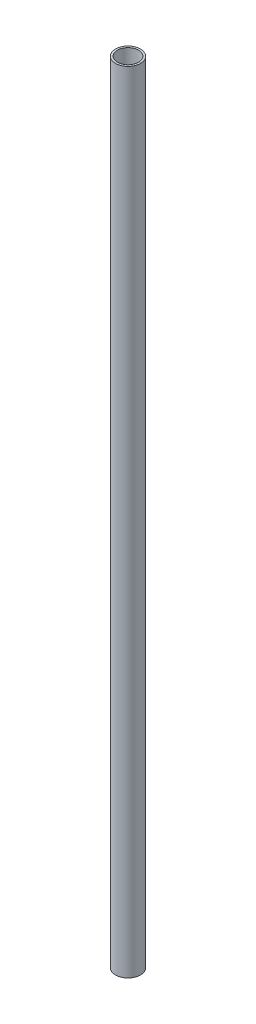
ISO-10303-21;
HEADER;
FILE_DESCRIPTION(('STEP AP214'),'2;1');
FILE_NAME('part.step','',(''),(''),'','','');
FILE_SCHEMA(('AUTOMOTIVE_DESIGN { 1 0 10303 214 1 1 1 1 }'));
ENDSEC;
DATA;
#1=APPLICATION_CONTEXT('core data for automotive mechanical design processes');
#2=APPLICATION_PROTOCOL_DEFINITION('international standard','automotive_design',2000,#1);
#3=PRODUCT_CONTEXT('',#1,'mechanical');
#4=PRODUCT('Part','Part','',(#3));
#5=PRODUCT_RELATED_PRODUCT_CATEGORY('part','',(#4));
#6=PRODUCT_DEFINITION_FORMATION('','',#4);
#7=PRODUCT_DEFINITION_CONTEXT('part definition',#1,'design');
#8=PRODUCT_DEFINITION('design','',#6,#7);
#9=PRODUCT_DEFINITION_SHAPE('','',#8);
#10=(LENGTH_UNIT() NAMED_UNIT(*) SI_UNIT(.MILLI.,.METRE.));
#11=(NAMED_UNIT(*) PLANE_ANGLE_UNIT() SI_UNIT($,.RADIAN.));
#12=(NAMED_UNIT(*) SI_UNIT($,.STERADIAN.) SOLID_ANGLE_UNIT());
#13=UNCERTAINTY_MEASURE_WITH_UNIT(LENGTH_MEASURE(1.E-05),#10,'distance_accuracy_value','');
#14=(GEOMETRIC_REPRESENTATION_CONTEXT(3) GLOBAL_UNCERTAINTY_ASSIGNED_CONTEXT((#13)) GLOBAL_UNIT_ASSIGNED_CONTEXT((#10,
#11,#12)) REPRESENTATION_CONTEXT('',''));
#15=CARTESIAN_POINT('',(0.,0.,0.));
#16=DIRECTION('',(0.,0.,1.));
#17=DIRECTION('',(1.,0.,0.));
#18=AXIS2_PLACEMENT_3D('',#15,#16,#17);
#19=CARTESIAN_POINT('',(0.,501.65,0.));
#20=DIRECTION('',(0.,1.,0.));
#21=DIRECTION('',(0.,0.,1.));
#22=AXIS2_PLACEMENT_3D('',#19,#20,#21);
#23=PLANE('',#22);
#24=CARTESIAN_POINT('',(0.,501.65,0.));
#25=DIRECTION('',(0.,1.,0.));
#26=DIRECTION('',(0.,0.,1.));
#27=AXIS2_PLACEMENT_3D('',#24,#25,#26);
#28=CIRCLE('',#27,7.9375);
#29=CARTESIAN_POINT('',(0.,501.65,7.9375));
#30=VERTEX_POINT('',#29);
#31=EDGE_CURVE('E10',#30,#30,#28,.T.);
#32=ORIENTED_EDGE('',*,*,#31,.T.);
#33=EDGE_LOOP('',(#32));
#34=FACE_BOUND('',#33,.T.);
#35=CARTESIAN_POINT('',(0.,501.65,0.));
#36=DIRECTION('',(0.,1.,0.));
#37=DIRECTION('',(0.,0.,1.));
#38=AXIS2_PLACEMENT_3D('',#35,#36,#37);
#39=CIRCLE('',#38,6.6929);
#40=CARTESIAN_POINT('',(0.,501.65,6.6929));
#41=VERTEX_POINT('',#40);
#42=EDGE_CURVE('E48',#41,#41,#39,.T.);
#43=ORIENTED_EDGE('',*,*,#42,.F.);
#44=EDGE_LOOP('',(#43));
#45=FACE_BOUND('',#44,.T.);
#46=ADVANCED_FACE('F37',(#34,#45),#23,.T.);
#47=CARTESIAN_POINT('',(0.,0.,0.));
#48=DIRECTION('',(0.,1.,0.));
#49=DIRECTION('',(0.,0.,1.));
#50=AXIS2_PLACEMENT_3D('',#47,#48,#49);
#51=PLANE('',#50);
#52=CARTESIAN_POINT('',(0.,0.,0.));
#53=DIRECTION('',(0.,1.,0.));
#54=DIRECTION('',(0.,0.,1.));
#55=AXIS2_PLACEMENT_3D('',#52,#53,#54);
#56=CIRCLE('',#55,7.9375);
#57=CARTESIAN_POINT('',(0.,0.,7.9375));
#58=VERTEX_POINT('',#57);
#59=EDGE_CURVE('E41',#58,#58,#56,.T.);
#60=ORIENTED_EDGE('',*,*,#59,.F.);
#61=EDGE_LOOP('',(#60));
#62=FACE_BOUND('',#61,.T.);
#63=CARTESIAN_POINT('',(0.,0.,0.));
#64=DIRECTION('',(0.,1.,0.));
#65=DIRECTION('',(0.,0.,1.));
#66=AXIS2_PLACEMENT_3D('',#63,#64,#65);
#67=CIRCLE('',#66,6.6929);
#68=CARTESIAN_POINT('',(0.,0.,6.6929));
#69=VERTEX_POINT('',#68);
#70=EDGE_CURVE('E50',#69,#69,#67,.T.);
#71=ORIENTED_EDGE('',*,*,#70,.T.);
#72=EDGE_LOOP('',(#71));
#73=FACE_BOUND('',#72,.T.);
#74=ADVANCED_FACE('F60',(#62,#73),#51,.F.);
#75=CARTESIAN_POINT('',(0.,501.65,0.));
#76=DIRECTION('',(0.,-1.,0.));
#77=DIRECTION('',(0.,0.,-1.));
#78=AXIS2_PLACEMENT_3D('',#75,#76,#77);
#79=CYLINDRICAL_SURFACE('',#78,7.9375);
#80=ORIENTED_EDGE('',*,*,#31,.F.);
#81=EDGE_LOOP('',(#80));
#82=FACE_BOUND('',#81,.T.);
#83=ORIENTED_EDGE('',*,*,#59,.T.);
#84=EDGE_LOOP('',(#83));
#85=FACE_BOUND('',#84,.T.);
#86=ADVANCED_FACE('F39',(#82,#85),#79,.T.);
#87=CARTESIAN_POINT('',(0.,501.65,0.));
#88=DIRECTION('',(0.,-1.,0.));
#89=DIRECTION('',(0.,0.,-1.));
#90=AXIS2_PLACEMENT_3D('',#87,#88,#89);
#91=CYLINDRICAL_SURFACE('',#90,6.6929);
#92=ORIENTED_EDGE('',*,*,#42,.T.);
#93=EDGE_LOOP('',(#92));
#94=FACE_BOUND('',#93,.T.);
#95=ORIENTED_EDGE('',*,*,#70,.F.);
#96=EDGE_LOOP('',(#95));
#97=FACE_BOUND('',#96,.T.);
#98=ADVANCED_FACE('F56',(#94,#97),#91,.F.);
#99=CLOSED_SHELL('',(#46,#74,#86,#98));
#100=MANIFOLD_SOLID_BREP('B2',#99);
#101=ADVANCED_BREP_SHAPE_REPRESENTATION('',(#18,#100),#14);
#102=SHAPE_DEFINITION_REPRESENTATION(#9,#101);
ENDSEC;
END-ISO-10303-21;
